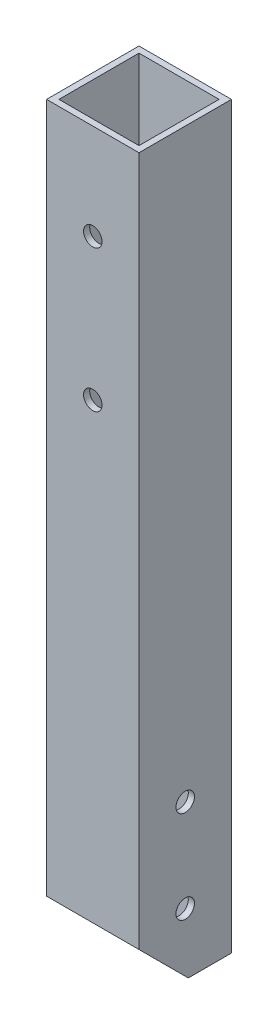
ISO-10303-21;
HEADER;
FILE_DESCRIPTION(('STEP AP214'),'2;1');
FILE_NAME('part.step','',(''),(''),'','','');
FILE_SCHEMA(('AUTOMOTIVE_DESIGN { 1 0 10303 214 1 1 1 1 }'));
ENDSEC;
DATA;
#1=APPLICATION_CONTEXT('core data for automotive mechanical design processes');
#2=APPLICATION_PROTOCOL_DEFINITION('international standard','automotive_design',2000,#1);
#3=PRODUCT_CONTEXT('',#1,'mechanical');
#4=PRODUCT('Part','Part','',(#3));
#5=PRODUCT_RELATED_PRODUCT_CATEGORY('part','',(#4));
#6=PRODUCT_DEFINITION_FORMATION('','',#4);
#7=PRODUCT_DEFINITION_CONTEXT('part definition',#1,'design');
#8=PRODUCT_DEFINITION('design','',#6,#7);
#9=PRODUCT_DEFINITION_SHAPE('','',#8);
#10=(LENGTH_UNIT() NAMED_UNIT(*) SI_UNIT(.MILLI.,.METRE.));
#11=(NAMED_UNIT(*) PLANE_ANGLE_UNIT() SI_UNIT($,.RADIAN.));
#12=(NAMED_UNIT(*) SI_UNIT($,.STERADIAN.) SOLID_ANGLE_UNIT());
#13=UNCERTAINTY_MEASURE_WITH_UNIT(LENGTH_MEASURE(1.E-05),#10,'distance_accuracy_value','');
#14=(GEOMETRIC_REPRESENTATION_CONTEXT(3) GLOBAL_UNCERTAINTY_ASSIGNED_CONTEXT((#13)) GLOBAL_UNIT_ASSIGNED_CONTEXT((#10,
#11,#12)) REPRESENTATION_CONTEXT('',''));
#15=CARTESIAN_POINT('',(0.,0.,0.));
#16=DIRECTION('',(0.,0.,1.));
#17=DIRECTION('',(1.,0.,0.));
#18=AXIS2_PLACEMENT_3D('',#15,#16,#17);
#19=CARTESIAN_POINT('',(0.,120.,0.));
#20=DIRECTION('',(0.,-1.,0.));
#21=DIRECTION('',(0.,0.,-1.));
#22=AXIS2_PLACEMENT_3D('',#19,#20,#21);
#23=PLANE('',#22);
#24=DIRECTION('',(0.,0.,-1.));
#25=VECTOR('',#24,1.);
#26=CARTESIAN_POINT('',(7.5,120.,7.5));
#27=LINE('',#26,#25);
#28=CARTESIAN_POINT('',(7.5,120.,7.5));
#29=VERTEX_POINT('',#28);
#30=CARTESIAN_POINT('',(7.5,120.,-7.5));
#31=VERTEX_POINT('',#30);
#32=EDGE_CURVE('E150',#29,#31,#27,.T.);
#33=ORIENTED_EDGE('',*,*,#32,.T.);
#34=DIRECTION('',(-1.,0.,0.));
#35=VECTOR('',#34,1.);
#36=CARTESIAN_POINT('',(-7.5,120.,-7.5));
#37=LINE('',#36,#35);
#38=CARTESIAN_POINT('',(-7.5,120.,-7.5));
#39=VERTEX_POINT('',#38);
#40=EDGE_CURVE('E226',#31,#39,#37,.T.);
#41=ORIENTED_EDGE('',*,*,#40,.T.);
#42=DIRECTION('',(0.,0.,1.));
#43=VECTOR('',#42,1.);
#44=CARTESIAN_POINT('',(-7.5,120.,7.5));
#45=LINE('',#44,#43);
#46=CARTESIAN_POINT('',(-7.5,120.,7.5));
#47=VERTEX_POINT('',#46);
#48=EDGE_CURVE('E227',#39,#47,#45,.T.);
#49=ORIENTED_EDGE('',*,*,#48,.T.);
#50=DIRECTION('',(1.,0.,0.));
#51=VECTOR('',#50,1.);
#52=CARTESIAN_POINT('',(-7.5,120.,7.5));
#53=LINE('',#52,#51);
#54=EDGE_CURVE('E145',#47,#29,#53,.T.);
#55=ORIENTED_EDGE('',*,*,#54,.T.);
#56=EDGE_LOOP('',(#33,#41,#49,#55));
#57=FACE_BOUND('',#56,.T.);
#58=DIRECTION('',(0.,0.,1.));
#59=VECTOR('',#58,1.);
#60=CARTESIAN_POINT('',(-6.5,120.,6.5));
#61=LINE('',#60,#59);
#62=CARTESIAN_POINT('',(-6.5,120.,-6.5));
#63=VERTEX_POINT('',#62);
#64=CARTESIAN_POINT('',(-6.5,120.,6.5));
#65=VERTEX_POINT('',#64);
#66=EDGE_CURVE('E203',#63,#65,#61,.T.);
#67=ORIENTED_EDGE('',*,*,#66,.F.);
#68=DIRECTION('',(-1.,0.,0.));
#69=VECTOR('',#68,1.);
#70=CARTESIAN_POINT('',(-6.5,120.,-6.5));
#71=LINE('',#70,#69);
#72=CARTESIAN_POINT('',(6.5,120.,-6.5));
#73=VERTEX_POINT('',#72);
#74=EDGE_CURVE('E210',#73,#63,#71,.T.);
#75=ORIENTED_EDGE('',*,*,#74,.F.);
#76=DIRECTION('',(0.,0.,-1.));
#77=VECTOR('',#76,1.);
#78=CARTESIAN_POINT('',(6.5,120.,6.5));
#79=LINE('',#78,#77);
#80=CARTESIAN_POINT('',(6.5,120.,6.5));
#81=VERTEX_POINT('',#80);
#82=EDGE_CURVE('E208',#81,#73,#79,.T.);
#83=ORIENTED_EDGE('',*,*,#82,.F.);
#84=DIRECTION('',(1.,0.,0.));
#85=VECTOR('',#84,1.);
#86=CARTESIAN_POINT('',(-6.5,120.,6.5));
#87=LINE('',#86,#85);
#88=EDGE_CURVE('E205',#65,#81,#87,.T.);
#89=ORIENTED_EDGE('',*,*,#88,.F.);
#90=EDGE_LOOP('',(#67,#75,#83,#89));
#91=FACE_BOUND('',#90,.T.);
#92=ADVANCED_FACE('F35',(#57,#91),#23,.F.);
#93=CARTESIAN_POINT('',(0.,0.,0.));
#94=DIRECTION('',(0.,-1.,0.));
#95=DIRECTION('',(0.,0.,-1.));
#96=AXIS2_PLACEMENT_3D('',#93,#94,#95);
#97=PLANE('',#96);
#98=DIRECTION('',(-1.,0.,0.));
#99=VECTOR('',#98,1.);
#100=CARTESIAN_POINT('',(7.5,0.,-0.500000000000085));
#101=LINE('',#100,#99);
#102=CARTESIAN_POINT('',(-6.5,0.,-0.500000000000085));
#103=VERTEX_POINT('',#102);
#104=CARTESIAN_POINT('',(-7.5,0.,-0.500000000000085));
#105=VERTEX_POINT('',#104);
#106=EDGE_CURVE('E120',#103,#105,#101,.T.);
#107=ORIENTED_EDGE('',*,*,#106,.T.);
#108=DIRECTION('',(0.,0.,1.));
#109=VECTOR('',#108,1.);
#110=CARTESIAN_POINT('',(-7.5,0.,7.5));
#111=LINE('',#110,#109);
#112=CARTESIAN_POINT('',(-7.5,0.,-7.5));
#113=VERTEX_POINT('',#112);
#114=EDGE_CURVE('E139',#113,#105,#111,.T.);
#115=ORIENTED_EDGE('',*,*,#114,.F.);
#116=DIRECTION('',(-1.,0.,0.));
#117=VECTOR('',#116,1.);
#118=CARTESIAN_POINT('',(-7.5,0.,-7.5));
#119=LINE('',#118,#117);
#120=CARTESIAN_POINT('',(7.5,0.,-7.5));
#121=VERTEX_POINT('',#120);
#122=EDGE_CURVE('E135',#121,#113,#119,.T.);
#123=ORIENTED_EDGE('',*,*,#122,.F.);
#124=DIRECTION('',(0.,0.,-1.));
#125=VECTOR('',#124,1.);
#126=CARTESIAN_POINT('',(7.5,0.,7.5));
#127=LINE('',#126,#125);
#128=CARTESIAN_POINT('',(7.5,0.,-0.500000000000085));
#129=VERTEX_POINT('',#128);
#130=EDGE_CURVE('E125',#129,#121,#127,.T.);
#131=ORIENTED_EDGE('',*,*,#130,.F.);
#132=CARTESIAN_POINT('',(6.5,0.,-0.500000000000085));
#133=VERTEX_POINT('',#132);
#134=EDGE_CURVE('E111',#129,#133,#101,.T.);
#135=ORIENTED_EDGE('',*,*,#134,.T.);
#136=DIRECTION('',(0.,0.,-1.));
#137=VECTOR('',#136,1.);
#138=CARTESIAN_POINT('',(6.5,0.,6.5));
#139=LINE('',#138,#137);
#140=CARTESIAN_POINT('',(6.5,0.,-6.5));
#141=VERTEX_POINT('',#140);
#142=EDGE_CURVE('E215',#133,#141,#139,.T.);
#143=ORIENTED_EDGE('',*,*,#142,.T.);
#144=DIRECTION('',(-1.,0.,0.));
#145=VECTOR('',#144,1.);
#146=CARTESIAN_POINT('',(-6.5,0.,-6.5));
#147=LINE('',#146,#145);
#148=CARTESIAN_POINT('',(-6.5,0.,-6.5));
#149=VERTEX_POINT('',#148);
#150=EDGE_CURVE('E206',#141,#149,#147,.T.);
#151=ORIENTED_EDGE('',*,*,#150,.T.);
#152=DIRECTION('',(0.,0.,1.));
#153=VECTOR('',#152,1.);
#154=CARTESIAN_POINT('',(-6.5,0.,6.5));
#155=LINE('',#154,#153);
#156=EDGE_CURVE('E202',#149,#103,#155,.T.);
#157=ORIENTED_EDGE('',*,*,#156,.T.);
#158=EDGE_LOOP('',(#107,#115,#123,#131,#135,#143,#151,#157));
#159=FACE_BOUND('',#158,.T.);
#160=ADVANCED_FACE('F133',(#159),#97,.T.);
#161=CARTESIAN_POINT('',(7.5,120.,7.5));
#162=DIRECTION('',(-1.,0.,0.));
#163=DIRECTION('',(0.,0.,1.));
#164=AXIS2_PLACEMENT_3D('',#161,#162,#163);
#165=PLANE('',#164);
#166=CARTESIAN_POINT('',(7.5,25.,0.));
#167=DIRECTION('',(-1.,0.,0.));
#168=DIRECTION('',(0.,0.,1.));
#169=AXIS2_PLACEMENT_3D('',#166,#167,#168);
#170=CIRCLE('',#169,1.5);
#171=CARTESIAN_POINT('',(7.5,25.,1.50000000000001));
#172=VERTEX_POINT('',#171);
#173=EDGE_CURVE('E247',#172,#172,#170,.T.);
#174=ORIENTED_EDGE('',*,*,#173,.T.);
#175=EDGE_LOOP('',(#174));
#176=FACE_BOUND('',#175,.T.);
#177=CARTESIAN_POINT('',(7.5,10.,0.));
#178=DIRECTION('',(-1.,0.,0.));
#179=DIRECTION('',(0.,0.,1.));
#180=AXIS2_PLACEMENT_3D('',#177,#178,#179);
#181=CIRCLE('',#180,1.5);
#182=CARTESIAN_POINT('',(7.5,10.,1.50000000000001));
#183=VERTEX_POINT('',#182);
#184=EDGE_CURVE('E172',#183,#183,#181,.T.);
#185=ORIENTED_EDGE('',*,*,#184,.T.);
#186=EDGE_LOOP('',(#185));
#187=FACE_BOUND('',#186,.T.);
#188=DIRECTION('',(0.,-1.,0.));
#189=VECTOR('',#188,1.);
#190=CARTESIAN_POINT('',(7.5,120.,7.5));
#191=LINE('',#190,#189);
#192=CARTESIAN_POINT('',(7.5,8.,7.5));
#193=VERTEX_POINT('',#192);
#194=EDGE_CURVE('E129',#29,#193,#191,.T.);
#195=ORIENTED_EDGE('',*,*,#194,.T.);
#196=DIRECTION('',(0.,-0.707106781186544,-0.707106781186551));
#197=VECTOR('',#196,1.);
#198=CARTESIAN_POINT('',(7.5,8.,7.5));
#199=LINE('',#198,#197);
#200=EDGE_CURVE('E114',#193,#129,#199,.T.);
#201=ORIENTED_EDGE('',*,*,#200,.T.);
#202=ORIENTED_EDGE('',*,*,#130,.T.);
#203=DIRECTION('',(0.,-1.,0.));
#204=VECTOR('',#203,1.);
#205=CARTESIAN_POINT('',(7.5,120.,-7.5));
#206=LINE('',#205,#204);
#207=EDGE_CURVE('E44',#31,#121,#206,.T.);
#208=ORIENTED_EDGE('',*,*,#207,.F.);
#209=ORIENTED_EDGE('',*,*,#32,.F.);
#210=EDGE_LOOP('',(#195,#201,#202,#208,#209));
#211=FACE_BOUND('',#210,.T.);
#212=ADVANCED_FACE('F37',(#176,#187,#211),#165,.F.);
#213=CARTESIAN_POINT('',(-7.5,120.,-7.5));
#214=DIRECTION('',(0.,0.,1.));
#215=DIRECTION('',(1.,0.,0.));
#216=AXIS2_PLACEMENT_3D('',#213,#214,#215);
#217=PLANE('',#216);
#218=CARTESIAN_POINT('',(0.,81.5,-7.5));
#219=DIRECTION('',(0.,0.,1.));
#220=DIRECTION('',(1.,0.,0.));
#221=AXIS2_PLACEMENT_3D('',#218,#219,#220);
#222=CIRCLE('',#221,1.5);
#223=CARTESIAN_POINT('',(1.50000000000001,81.5,-7.5));
#224=VERTEX_POINT('',#223);
#225=EDGE_CURVE('E168',#224,#224,#222,.T.);
#226=ORIENTED_EDGE('',*,*,#225,.T.);
#227=EDGE_LOOP('',(#226));
#228=FACE_BOUND('',#227,.T.);
#229=CARTESIAN_POINT('',(0.,104.5,-7.5));
#230=DIRECTION('',(0.,0.,1.));
#231=DIRECTION('',(1.,0.,0.));
#232=AXIS2_PLACEMENT_3D('',#229,#230,#231);
#233=CIRCLE('',#232,1.5);
#234=CARTESIAN_POINT('',(1.5,104.5,-7.5));
#235=VERTEX_POINT('',#234);
#236=EDGE_CURVE('E163',#235,#235,#233,.T.);
#237=ORIENTED_EDGE('',*,*,#236,.T.);
#238=EDGE_LOOP('',(#237));
#239=FACE_BOUND('',#238,.T.);
#240=ORIENTED_EDGE('',*,*,#122,.T.);
#241=DIRECTION('',(0.,-1.,0.));
#242=VECTOR('',#241,1.);
#243=CARTESIAN_POINT('',(-7.5,120.,-7.5));
#244=LINE('',#243,#242);
#245=EDGE_CURVE('E155',#39,#113,#244,.T.);
#246=ORIENTED_EDGE('',*,*,#245,.F.);
#247=ORIENTED_EDGE('',*,*,#40,.F.);
#248=ORIENTED_EDGE('',*,*,#207,.T.);
#249=EDGE_LOOP('',(#240,#246,#247,#248));
#250=FACE_BOUND('',#249,.T.);
#251=ADVANCED_FACE('F236',(#228,#239,#250),#217,.F.);
#252=CARTESIAN_POINT('',(-7.5,120.,7.5));
#253=DIRECTION('',(1.,0.,0.));
#254=DIRECTION('',(0.,0.,-1.));
#255=AXIS2_PLACEMENT_3D('',#252,#253,#254);
#256=PLANE('',#255);
#257=CARTESIAN_POINT('',(-7.5,25.,0.));
#258=DIRECTION('',(-1.,0.,0.));
#259=DIRECTION('',(0.,0.,1.));
#260=AXIS2_PLACEMENT_3D('',#257,#258,#259);
#261=CIRCLE('',#260,1.5);
#262=CARTESIAN_POINT('',(-7.5,25.,1.50000000000001));
#263=VERTEX_POINT('',#262);
#264=EDGE_CURVE('E244',#263,#263,#261,.T.);
#265=ORIENTED_EDGE('',*,*,#264,.F.);
#266=EDGE_LOOP('',(#265));
#267=FACE_BOUND('',#266,.T.);
#268=CARTESIAN_POINT('',(-7.5,10.,0.));
#269=DIRECTION('',(-1.,0.,0.));
#270=DIRECTION('',(0.,0.,1.));
#271=AXIS2_PLACEMENT_3D('',#268,#269,#270);
#272=CIRCLE('',#271,1.5);
#273=CARTESIAN_POINT('',(-7.5,10.,1.50000000000001));
#274=VERTEX_POINT('',#273);
#275=EDGE_CURVE('E179',#274,#274,#272,.T.);
#276=ORIENTED_EDGE('',*,*,#275,.F.);
#277=EDGE_LOOP('',(#276));
#278=FACE_BOUND('',#277,.T.);
#279=ORIENTED_EDGE('',*,*,#114,.T.);
#280=DIRECTION('',(0.,-0.707106781186544,-0.707106781186551));
#281=VECTOR('',#280,1.);
#282=CARTESIAN_POINT('',(-7.5,8.,7.5));
#283=LINE('',#282,#281);
#284=CARTESIAN_POINT('',(-7.5,8.,7.5));
#285=VERTEX_POINT('',#284);
#286=EDGE_CURVE('E130',#285,#105,#283,.T.);
#287=ORIENTED_EDGE('',*,*,#286,.F.);
#288=DIRECTION('',(0.,-1.,0.));
#289=VECTOR('',#288,1.);
#290=CARTESIAN_POINT('',(-7.5,120.,7.5));
#291=LINE('',#290,#289);
#292=EDGE_CURVE('E152',#47,#285,#291,.T.);
#293=ORIENTED_EDGE('',*,*,#292,.F.);
#294=ORIENTED_EDGE('',*,*,#48,.F.);
#295=ORIENTED_EDGE('',*,*,#245,.T.);
#296=EDGE_LOOP('',(#279,#287,#293,#294,#295));
#297=FACE_BOUND('',#296,.T.);
#298=ADVANCED_FACE('F239',(#267,#278,#297),#256,.F.);
#299=CARTESIAN_POINT('',(-7.5,120.,7.5));
#300=DIRECTION('',(0.,0.,-1.));
#301=DIRECTION('',(-1.,0.,0.));
#302=AXIS2_PLACEMENT_3D('',#299,#300,#301);
#303=PLANE('',#302);
#304=CARTESIAN_POINT('',(0.,81.5,7.5));
#305=DIRECTION('',(0.,0.,1.));
#306=DIRECTION('',(1.,0.,0.));
#307=AXIS2_PLACEMENT_3D('',#304,#305,#306);
#308=CIRCLE('',#307,1.5);
#309=CARTESIAN_POINT('',(1.50000000000001,81.5,7.5));
#310=VERTEX_POINT('',#309);
#311=EDGE_CURVE('E176',#310,#310,#308,.T.);
#312=ORIENTED_EDGE('',*,*,#311,.F.);
#313=EDGE_LOOP('',(#312));
#314=FACE_BOUND('',#313,.T.);
#315=CARTESIAN_POINT('',(0.,104.5,7.5));
#316=DIRECTION('',(0.,0.,1.));
#317=DIRECTION('',(1.,0.,0.));
#318=AXIS2_PLACEMENT_3D('',#315,#316,#317);
#319=CIRCLE('',#318,1.5);
#320=CARTESIAN_POINT('',(1.5,104.5,7.5));
#321=VERTEX_POINT('',#320);
#322=EDGE_CURVE('E195',#321,#321,#319,.T.);
#323=ORIENTED_EDGE('',*,*,#322,.F.);
#324=EDGE_LOOP('',(#323));
#325=FACE_BOUND('',#324,.T.);
#326=ORIENTED_EDGE('',*,*,#292,.T.);
#327=DIRECTION('',(-1.,0.,0.));
#328=VECTOR('',#327,1.);
#329=CARTESIAN_POINT('',(7.5,8.,7.5));
#330=LINE('',#329,#328);
#331=EDGE_CURVE('E119',#193,#285,#330,.T.);
#332=ORIENTED_EDGE('',*,*,#331,.F.);
#333=ORIENTED_EDGE('',*,*,#194,.F.);
#334=ORIENTED_EDGE('',*,*,#54,.F.);
#335=EDGE_LOOP('',(#326,#332,#333,#334));
#336=FACE_BOUND('',#335,.T.);
#337=ADVANCED_FACE('F234',(#314,#325,#336),#303,.F.);
#338=CARTESIAN_POINT('',(-6.5,120.,6.5));
#339=DIRECTION('',(1.,0.,0.));
#340=DIRECTION('',(0.,0.,-1.));
#341=AXIS2_PLACEMENT_3D('',#338,#339,#340);
#342=PLANE('',#341);
#343=CARTESIAN_POINT('',(-6.5,25.,0.));
#344=DIRECTION('',(1.,0.,0.));
#345=DIRECTION('',(0.,0.,-1.));
#346=AXIS2_PLACEMENT_3D('',#343,#344,#345);
#347=CIRCLE('',#346,1.5);
#348=CARTESIAN_POINT('',(-6.5,25.,-1.49999999999999));
#349=VERTEX_POINT('',#348);
#350=EDGE_CURVE('E184',#349,#349,#347,.T.);
#351=ORIENTED_EDGE('',*,*,#350,.F.);
#352=EDGE_LOOP('',(#351));
#353=FACE_BOUND('',#352,.T.);
#354=DIRECTION('',(0.,0.707106781186544,0.707106781186551));
#355=VECTOR('',#354,1.);
#356=CARTESIAN_POINT('',(-6.5,63.4999999999994,63.));
#357=LINE('',#356,#355);
#358=CARTESIAN_POINT('',(-6.5,7.00000000000001,6.5));
#359=VERTEX_POINT('',#358);
#360=EDGE_CURVE('E246',#103,#359,#357,.T.);
#361=ORIENTED_EDGE('',*,*,#360,.F.);
#362=ORIENTED_EDGE('',*,*,#156,.F.);
#363=DIRECTION('',(0.,-1.,0.));
#364=VECTOR('',#363,1.);
#365=CARTESIAN_POINT('',(-6.5,120.,-6.5));
#366=LINE('',#365,#364);
#367=EDGE_CURVE('E212',#63,#149,#366,.T.);
#368=ORIENTED_EDGE('',*,*,#367,.F.);
#369=ORIENTED_EDGE('',*,*,#66,.T.);
#370=DIRECTION('',(0.,-1.,0.));
#371=VECTOR('',#370,1.);
#372=CARTESIAN_POINT('',(-6.5,120.,6.5));
#373=LINE('',#372,#371);
#374=EDGE_CURVE('E137',#65,#359,#373,.T.);
#375=ORIENTED_EDGE('',*,*,#374,.T.);
#376=EDGE_LOOP('',(#361,#362,#368,#369,#375));
#377=FACE_BOUND('',#376,.T.);
#378=CARTESIAN_POINT('',(-6.5,10.,0.));
#379=DIRECTION('',(1.,0.,0.));
#380=DIRECTION('',(0.,0.,-1.));
#381=AXIS2_PLACEMENT_3D('',#378,#379,#380);
#382=CIRCLE('',#381,1.5);
#383=CARTESIAN_POINT('',(-6.5,10.,-1.49999999999999));
#384=VERTEX_POINT('',#383);
#385=EDGE_CURVE('E171',#384,#384,#382,.T.);
#386=ORIENTED_EDGE('',*,*,#385,.F.);
#387=EDGE_LOOP('',(#386));
#388=FACE_BOUND('',#387,.T.);
#389=ADVANCED_FACE('F258',(#353,#377,#388),#342,.T.);
#390=CARTESIAN_POINT('',(-6.5,120.,6.5));
#391=DIRECTION('',(0.,0.,-1.));
#392=DIRECTION('',(-1.,0.,0.));
#393=AXIS2_PLACEMENT_3D('',#390,#391,#392);
#394=PLANE('',#393);
#395=DIRECTION('',(1.,0.,0.));
#396=VECTOR('',#395,1.);
#397=CARTESIAN_POINT('',(-6.5,7.00000000000001,6.5));
#398=LINE('',#397,#396);
#399=CARTESIAN_POINT('',(6.5,6.99999999999998,6.49999999999999));
#400=VERTEX_POINT('',#399);
#401=EDGE_CURVE('E50',#359,#400,#398,.T.);
#402=ORIENTED_EDGE('',*,*,#401,.F.);
#403=ORIENTED_EDGE('',*,*,#374,.F.);
#404=ORIENTED_EDGE('',*,*,#88,.T.);
#405=DIRECTION('',(0.,-1.,0.));
#406=VECTOR('',#405,1.);
#407=CARTESIAN_POINT('',(6.5,120.,6.5));
#408=LINE('',#407,#406);
#409=EDGE_CURVE('E142',#81,#400,#408,.T.);
#410=ORIENTED_EDGE('',*,*,#409,.T.);
#411=EDGE_LOOP('',(#402,#403,#404,#410));
#412=FACE_BOUND('',#411,.T.);
#413=CARTESIAN_POINT('',(0.,81.5,6.5));
#414=DIRECTION('',(0.,0.,-1.));
#415=DIRECTION('',(-1.,0.,0.));
#416=AXIS2_PLACEMENT_3D('',#413,#414,#415);
#417=CIRCLE('',#416,1.5);
#418=CARTESIAN_POINT('',(-1.5,81.5,6.5));
#419=VERTEX_POINT('',#418);
#420=EDGE_CURVE('E167',#419,#419,#417,.T.);
#421=ORIENTED_EDGE('',*,*,#420,.F.);
#422=EDGE_LOOP('',(#421));
#423=FACE_BOUND('',#422,.T.);
#424=CARTESIAN_POINT('',(0.,104.5,6.5));
#425=DIRECTION('',(0.,0.,-1.));
#426=DIRECTION('',(-1.,0.,0.));
#427=AXIS2_PLACEMENT_3D('',#424,#425,#426);
#428=CIRCLE('',#427,1.5);
#429=CARTESIAN_POINT('',(-1.5,104.5,6.5));
#430=VERTEX_POINT('',#429);
#431=EDGE_CURVE('E162',#430,#430,#428,.T.);
#432=ORIENTED_EDGE('',*,*,#431,.F.);
#433=EDGE_LOOP('',(#432));
#434=FACE_BOUND('',#433,.T.);
#435=ADVANCED_FACE('F261',(#412,#423,#434),#394,.T.);
#436=CARTESIAN_POINT('',(6.5,120.,6.5));
#437=DIRECTION('',(-1.,0.,0.));
#438=DIRECTION('',(0.,0.,1.));
#439=AXIS2_PLACEMENT_3D('',#436,#437,#438);
#440=PLANE('',#439);
#441=CARTESIAN_POINT('',(6.5,25.,0.));
#442=DIRECTION('',(-1.,0.,0.));
#443=DIRECTION('',(0.,0.,1.));
#444=AXIS2_PLACEMENT_3D('',#441,#442,#443);
#445=CIRCLE('',#444,1.5);
#446=CARTESIAN_POINT('',(6.5,25.,1.50000000000001));
#447=VERTEX_POINT('',#446);
#448=EDGE_CURVE('E39',#447,#447,#445,.T.);
#449=ORIENTED_EDGE('',*,*,#448,.F.);
#450=EDGE_LOOP('',(#449));
#451=FACE_BOUND('',#450,.T.);
#452=DIRECTION('',(0.,-0.707106781186544,-0.707106781186551));
#453=VECTOR('',#452,1.);
#454=CARTESIAN_POINT('',(6.5,63.4999999999994,63.));
#455=LINE('',#454,#453);
#456=EDGE_CURVE('E11',#400,#133,#455,.T.);
#457=ORIENTED_EDGE('',*,*,#456,.F.);
#458=ORIENTED_EDGE('',*,*,#409,.F.);
#459=ORIENTED_EDGE('',*,*,#82,.T.);
#460=DIRECTION('',(0.,-1.,0.));
#461=VECTOR('',#460,1.);
#462=CARTESIAN_POINT('',(6.5,120.,-6.5));
#463=LINE('',#462,#461);
#464=EDGE_CURVE('E58',#73,#141,#463,.T.);
#465=ORIENTED_EDGE('',*,*,#464,.T.);
#466=ORIENTED_EDGE('',*,*,#142,.F.);
#467=EDGE_LOOP('',(#457,#458,#459,#465,#466));
#468=FACE_BOUND('',#467,.T.);
#469=CARTESIAN_POINT('',(6.5,10.,0.));
#470=DIRECTION('',(-1.,0.,0.));
#471=DIRECTION('',(0.,0.,1.));
#472=AXIS2_PLACEMENT_3D('',#469,#470,#471);
#473=CIRCLE('',#472,1.5);
#474=CARTESIAN_POINT('',(6.5,10.,1.50000000000001));
#475=VERTEX_POINT('',#474);
#476=EDGE_CURVE('E169',#475,#475,#473,.T.);
#477=ORIENTED_EDGE('',*,*,#476,.F.);
#478=EDGE_LOOP('',(#477));
#479=FACE_BOUND('',#478,.T.);
#480=ADVANCED_FACE('F293',(#451,#468,#479),#440,.T.);
#481=CARTESIAN_POINT('',(-6.5,120.,-6.5));
#482=DIRECTION('',(0.,0.,1.));
#483=DIRECTION('',(1.,0.,0.));
#484=AXIS2_PLACEMENT_3D('',#481,#482,#483);
#485=PLANE('',#484);
#486=CARTESIAN_POINT('',(0.,81.5,-6.5));
#487=DIRECTION('',(0.,0.,1.));
#488=DIRECTION('',(1.,0.,0.));
#489=AXIS2_PLACEMENT_3D('',#486,#487,#488);
#490=CIRCLE('',#489,1.5);
#491=CARTESIAN_POINT('',(1.50000000000001,81.5,-6.5));
#492=VERTEX_POINT('',#491);
#493=EDGE_CURVE('E164',#492,#492,#490,.T.);
#494=ORIENTED_EDGE('',*,*,#493,.F.);
#495=EDGE_LOOP('',(#494));
#496=FACE_BOUND('',#495,.T.);
#497=CARTESIAN_POINT('',(0.,104.5,-6.5));
#498=DIRECTION('',(0.,0.,1.));
#499=DIRECTION('',(1.,0.,0.));
#500=AXIS2_PLACEMENT_3D('',#497,#498,#499);
#501=CIRCLE('',#500,1.5);
#502=CARTESIAN_POINT('',(1.5,104.5,-6.5));
#503=VERTEX_POINT('',#502);
#504=EDGE_CURVE('E159',#503,#503,#501,.T.);
#505=ORIENTED_EDGE('',*,*,#504,.F.);
#506=EDGE_LOOP('',(#505));
#507=FACE_BOUND('',#506,.T.);
#508=ORIENTED_EDGE('',*,*,#150,.F.);
#509=ORIENTED_EDGE('',*,*,#464,.F.);
#510=ORIENTED_EDGE('',*,*,#74,.T.);
#511=ORIENTED_EDGE('',*,*,#367,.T.);
#512=EDGE_LOOP('',(#508,#509,#510,#511));
#513=FACE_BOUND('',#512,.T.);
#514=ADVANCED_FACE('F297',(#496,#507,#513),#485,.T.);
#515=CARTESIAN_POINT('',(0.,104.5,-7.5));
#516=DIRECTION('',(0.,0.,1.));
#517=DIRECTION('',(1.,0.,0.));
#518=AXIS2_PLACEMENT_3D('',#515,#516,#517);
#519=CYLINDRICAL_SURFACE('',#518,1.5);
#520=ORIENTED_EDGE('',*,*,#504,.T.);
#521=EDGE_LOOP('',(#520));
#522=FACE_BOUND('',#521,.T.);
#523=ORIENTED_EDGE('',*,*,#236,.F.);
#524=EDGE_LOOP('',(#523));
#525=FACE_BOUND('',#524,.T.);
#526=ADVANCED_FACE('F301',(#522,#525),#519,.F.);
#527=ORIENTED_EDGE('',*,*,#431,.T.);
#528=EDGE_LOOP('',(#527));
#529=FACE_BOUND('',#528,.T.);
#530=ORIENTED_EDGE('',*,*,#322,.T.);
#531=EDGE_LOOP('',(#530));
#532=FACE_BOUND('',#531,.T.);
#533=ADVANCED_FACE('F305',(#529,#532),#519,.F.);
#534=CARTESIAN_POINT('',(0.,81.5,-7.5));
#535=DIRECTION('',(0.,0.,1.));
#536=DIRECTION('',(1.,0.,0.));
#537=AXIS2_PLACEMENT_3D('',#534,#535,#536);
#538=CYLINDRICAL_SURFACE('',#537,1.5);
#539=ORIENTED_EDGE('',*,*,#493,.T.);
#540=EDGE_LOOP('',(#539));
#541=FACE_BOUND('',#540,.T.);
#542=ORIENTED_EDGE('',*,*,#225,.F.);
#543=EDGE_LOOP('',(#542));
#544=FACE_BOUND('',#543,.T.);
#545=ADVANCED_FACE('F307',(#541,#544),#538,.F.);
#546=ORIENTED_EDGE('',*,*,#420,.T.);
#547=EDGE_LOOP('',(#546));
#548=FACE_BOUND('',#547,.T.);
#549=ORIENTED_EDGE('',*,*,#311,.T.);
#550=EDGE_LOOP('',(#549));
#551=FACE_BOUND('',#550,.T.);
#552=ADVANCED_FACE('F309',(#548,#551),#538,.F.);
#553=CARTESIAN_POINT('',(7.5,10.,0.));
#554=DIRECTION('',(-1.,0.,0.));
#555=DIRECTION('',(0.,0.,1.));
#556=AXIS2_PLACEMENT_3D('',#553,#554,#555);
#557=CYLINDRICAL_SURFACE('',#556,1.5);
#558=ORIENTED_EDGE('',*,*,#476,.T.);
#559=EDGE_LOOP('',(#558));
#560=FACE_BOUND('',#559,.T.);
#561=ORIENTED_EDGE('',*,*,#184,.F.);
#562=EDGE_LOOP('',(#561));
#563=FACE_BOUND('',#562,.T.);
#564=ADVANCED_FACE('F269',(#560,#563),#557,.F.);
#565=ORIENTED_EDGE('',*,*,#385,.T.);
#566=EDGE_LOOP('',(#565));
#567=FACE_BOUND('',#566,.T.);
#568=ORIENTED_EDGE('',*,*,#275,.T.);
#569=EDGE_LOOP('',(#568));
#570=FACE_BOUND('',#569,.T.);
#571=ADVANCED_FACE('F266',(#567,#570),#557,.F.);
#572=CARTESIAN_POINT('',(7.5,8.,7.5));
#573=DIRECTION('',(0.,0.707106781186551,-0.707106781186544));
#574=DIRECTION('',(0.,0.707106781186544,0.707106781186551));
#575=AXIS2_PLACEMENT_3D('',#572,#573,#574);
#576=PLANE('',#575);
#577=ORIENTED_EDGE('',*,*,#360,.T.);
#578=ORIENTED_EDGE('',*,*,#401,.T.);
#579=ORIENTED_EDGE('',*,*,#456,.T.);
#580=ORIENTED_EDGE('',*,*,#134,.F.);
#581=ORIENTED_EDGE('',*,*,#200,.F.);
#582=ORIENTED_EDGE('',*,*,#331,.T.);
#583=ORIENTED_EDGE('',*,*,#286,.T.);
#584=ORIENTED_EDGE('',*,*,#106,.F.);
#585=EDGE_LOOP('',(#577,#578,#579,#580,#581,#582,#583,#584));
#586=FACE_BOUND('',#585,.T.);
#587=ADVANCED_FACE('F113',(#586),#576,.F.);
#588=CARTESIAN_POINT('',(7.5,25.,0.));
#589=DIRECTION('',(-1.,0.,0.));
#590=DIRECTION('',(0.,0.,1.));
#591=AXIS2_PLACEMENT_3D('',#588,#589,#590);
#592=CYLINDRICAL_SURFACE('',#591,1.5);
#593=ORIENTED_EDGE('',*,*,#448,.T.);
#594=EDGE_LOOP('',(#593));
#595=FACE_BOUND('',#594,.T.);
#596=ORIENTED_EDGE('',*,*,#173,.F.);
#597=EDGE_LOOP('',(#596));
#598=FACE_BOUND('',#597,.T.);
#599=ADVANCED_FACE('F315',(#595,#598),#592,.F.);
#600=ORIENTED_EDGE('',*,*,#350,.T.);
#601=EDGE_LOOP('',(#600));
#602=FACE_BOUND('',#601,.T.);
#603=ORIENTED_EDGE('',*,*,#264,.T.);
#604=EDGE_LOOP('',(#603));
#605=FACE_BOUND('',#604,.T.);
#606=ADVANCED_FACE('F255',(#602,#605),#592,.F.);
#607=CLOSED_SHELL('',(#92,#160,#212,#251,#298,#337,#389,#435,#480,#514,#526,#533,#545,#552,#564,
#571,#587,#599,#606));
#608=MANIFOLD_SOLID_BREP('B2',#607);
#609=ADVANCED_BREP_SHAPE_REPRESENTATION('',(#18,#608),#14);
#610=SHAPE_DEFINITION_REPRESENTATION(#9,#609);
ENDSEC;
END-ISO-10303-21;
